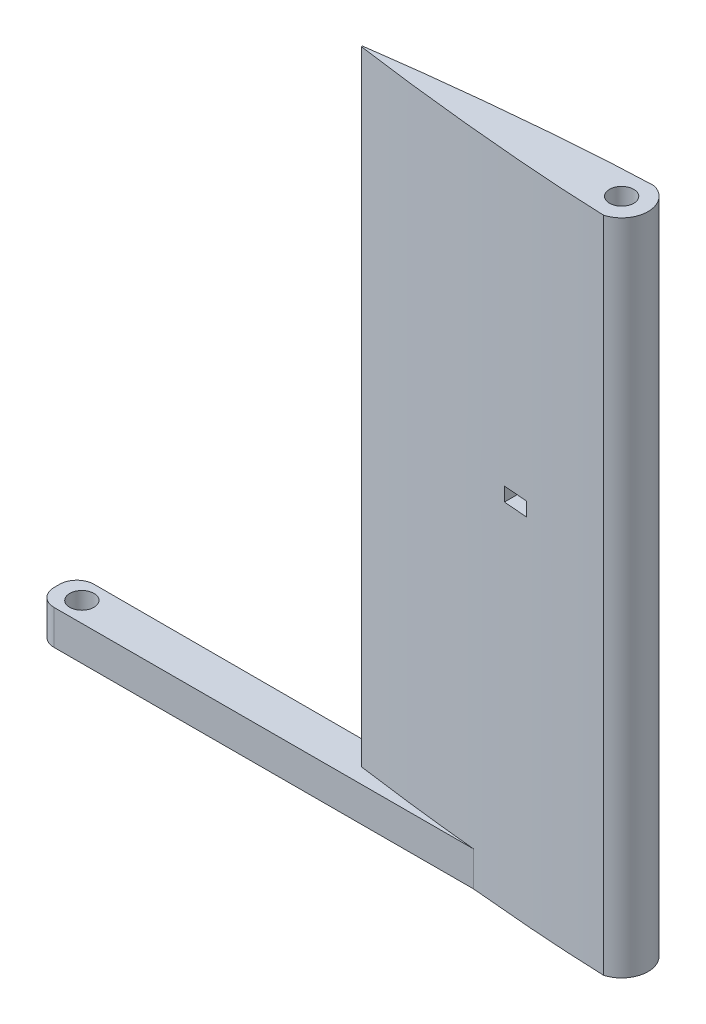
ISO-10303-21;
HEADER;
FILE_DESCRIPTION(('STEP AP214'),'2;1');
FILE_NAME('part.step','',(''),(''),'','','');
FILE_SCHEMA(('AUTOMOTIVE_DESIGN { 1 0 10303 214 1 1 1 1 }'));
ENDSEC;
DATA;
#1=APPLICATION_CONTEXT('core data for automotive mechanical design processes');
#2=APPLICATION_PROTOCOL_DEFINITION('international standard','automotive_design',2000,#1);
#3=PRODUCT_CONTEXT('',#1,'mechanical');
#4=PRODUCT('Part','Part','',(#3));
#5=PRODUCT_RELATED_PRODUCT_CATEGORY('part','',(#4));
#6=PRODUCT_DEFINITION_FORMATION('','',#4);
#7=PRODUCT_DEFINITION_CONTEXT('part definition',#1,'design');
#8=PRODUCT_DEFINITION('design','',#6,#7);
#9=PRODUCT_DEFINITION_SHAPE('','',#8);
#10=(LENGTH_UNIT() NAMED_UNIT(*) SI_UNIT(.MILLI.,.METRE.));
#11=(NAMED_UNIT(*) PLANE_ANGLE_UNIT() SI_UNIT($,.RADIAN.));
#12=(NAMED_UNIT(*) SI_UNIT($,.STERADIAN.) SOLID_ANGLE_UNIT());
#13=UNCERTAINTY_MEASURE_WITH_UNIT(LENGTH_MEASURE(1.E-05),#10,'distance_accuracy_value','');
#14=(GEOMETRIC_REPRESENTATION_CONTEXT(3) GLOBAL_UNCERTAINTY_ASSIGNED_CONTEXT((#13)) GLOBAL_UNIT_ASSIGNED_CONTEXT((#10,
#11,#12)) REPRESENTATION_CONTEXT('',''));
#15=CARTESIAN_POINT('',(0.,0.,0.));
#16=DIRECTION('',(0.,0.,1.));
#17=DIRECTION('',(1.,0.,0.));
#18=AXIS2_PLACEMENT_3D('',#15,#16,#17);
#19=CARTESIAN_POINT('',(-22.3000335584767,96.52,-0.421731992758527));
#20=CARTESIAN_POINT('',(-21.2419414138823,96.52,-0.275782192456182));
#21=CARTESIAN_POINT('',(-19.1268563533446,96.52,0.0159657841118418));
#22=CARTESIAN_POINT('',(-15.9513768445541,96.52,0.420945700754212));
#23=CARTESIAN_POINT('',(-12.7763413638604,96.52,0.805621297972043));
#24=CARTESIAN_POINT('',(-9.60116832794026,96.52,1.16714064150426));
#25=CARTESIAN_POINT('',(-6.42611192187,96.52,1.50822751108855));
#26=CARTESIAN_POINT('',(-3.25109867110428,96.52,1.82841891986337));
#27=CARTESIAN_POINT('',(-0.0761486453770277,96.52,2.12685616267836));
#28=CARTESIAN_POINT('',(3.09891867077607,96.52,2.39984293819857));
#29=CARTESIAN_POINT('',(6.27387103325091,96.52,2.64782488629556));
#30=CARTESIAN_POINT('',(9.47006467937847,96.52,2.8664977924313));
#31=CARTESIAN_POINT('',(12.6661626264162,96.52,3.05362844309234));
#32=CARTESIAN_POINT('',(15.1399259141342,96.52,3.16085624533642));
#33=CARTESIAN_POINT('',(16.5338816835493,96.52,3.21108424025308));
#34=CARTESIAN_POINT('',(16.8691309393359,96.52,3.22220716780132));
#35=B_SPLINE_CURVE_WITH_KNOTS('',3,(#19,#20,#21,#22,#23,#24,#25,#26,#27,#28,#29,#30,#31,#32,#33,
#34),.UNSPECIFIED.,.F.,.F.,(4,1,1,1,1,1,1,1,1,1,1,1,1,4),(0.697451101376656,0.722085332605875,
0.746693971874219,0.771280881618741,0.795847852353792,0.820397097848366,0.844929663207614,
0.869445681924214,0.893944653527209,0.918427287456432,0.942893193888412,0.967831579658849,
0.992264069895196,1.),.UNSPECIFIED.);
#36=DIRECTION('',(0.,-1.,0.));
#37=VECTOR('',#36,1.);
#38=SURFACE_OF_LINEAR_EXTRUSION('',#35,#37);
#39=CARTESIAN_POINT('',(-22.3000335584767,51.8554787804758,-0.421731992758527));
#40=CARTESIAN_POINT('',(-21.2419414138823,51.8554787804758,-0.275782192456182));
#41=CARTESIAN_POINT('',(-19.1268563533446,51.8554787804758,0.0159657841118418));
#42=CARTESIAN_POINT('',(-15.9513768445541,51.8554787804758,0.420945700754212));
#43=CARTESIAN_POINT('',(-12.7763413638604,51.8554787804758,0.805621297972043));
#44=CARTESIAN_POINT('',(-9.60116832794026,51.8554787804758,1.16714064150426));
#45=CARTESIAN_POINT('',(-6.42611192187,51.8554787804758,1.50822751108855));
#46=CARTESIAN_POINT('',(-3.25109867110428,51.8554787804758,1.82841891986337));
#47=CARTESIAN_POINT('',(-0.0761486453770277,51.8554787804758,2.12685616267836));
#48=CARTESIAN_POINT('',(3.09891867077607,51.8554787804758,2.39984293819857));
#49=CARTESIAN_POINT('',(6.27387103325091,51.8554787804758,2.64782488629556));
#50=CARTESIAN_POINT('',(9.47006467937847,51.8554787804758,2.8664977924313));
#51=CARTESIAN_POINT('',(12.6661626264162,51.8554787804758,3.05362844309234));
#52=CARTESIAN_POINT('',(15.1399259141342,51.8554787804758,3.16085624533642));
#53=CARTESIAN_POINT('',(16.5338816835493,51.8554787804758,3.21108424025308));
#54=CARTESIAN_POINT('',(16.8691309393359,51.8554787804758,3.22220716780132));
#55=B_SPLINE_CURVE_WITH_KNOTS('',3,(#39,#40,#41,#42,#43,#44,#45,#46,#47,#48,#49,#50,#51,#52,#53,
#54),.UNSPECIFIED.,.F.,.F.,(4,1,1,1,1,1,1,1,1,1,1,1,1,4),(0.697451101376656,0.722085332605875,
0.746693971874219,0.771280881618741,0.795847852353792,0.820397097848366,0.844929663207614,
0.869445681924214,0.893944653527209,0.918427287456432,0.942893193888412,0.967831579658849,
0.992264069895196,1.),.UNSPECIFIED.);
#56=CARTESIAN_POINT('',(4.90978113409312,51.8554787804758,2.54));
#57=VERTEX_POINT('',#56);
#58=CARTESIAN_POINT('',(1.35733648457214,51.8554787804757,2.24902105413004));
#59=VERTEX_POINT('',#58);
#60=EDGE_CURVE('E372',#57,#59,#55,.F.);
#61=ORIENTED_EDGE('',*,*,#60,.T.);
#62=DIRECTION('',(0.,-1.,0.));
#63=VECTOR('',#62,1.);
#64=CARTESIAN_POINT('',(1.35733648457217,96.52,2.24902105405757));
#65=LINE('',#64,#63);
#66=CARTESIAN_POINT('',(1.35733648457214,53.8874787804757,2.24902105413004));
#67=VERTEX_POINT('',#66);
#68=EDGE_CURVE('E326',#59,#67,#65,.F.);
#69=ORIENTED_EDGE('',*,*,#68,.T.);
#70=CARTESIAN_POINT('',(-22.3000335584767,53.8874787804758,-0.421731992758527));
#71=CARTESIAN_POINT('',(-21.2419414138823,53.8874787804758,-0.275782192456182));
#72=CARTESIAN_POINT('',(-19.1268563533446,53.8874787804758,0.0159657841118418));
#73=CARTESIAN_POINT('',(-15.9513768445541,53.8874787804758,0.420945700754212));
#74=CARTESIAN_POINT('',(-12.7763413638604,53.8874787804758,0.805621297972043));
#75=CARTESIAN_POINT('',(-9.60116832794026,53.8874787804758,1.16714064150426));
#76=CARTESIAN_POINT('',(-6.42611192187,53.8874787804758,1.50822751108855));
#77=CARTESIAN_POINT('',(-3.25109867110428,53.8874787804758,1.82841891986337));
#78=CARTESIAN_POINT('',(-0.0761486453770277,53.8874787804758,2.12685616267836));
#79=CARTESIAN_POINT('',(3.09891867077607,53.8874787804758,2.39984293819857));
#80=CARTESIAN_POINT('',(6.27387103325091,53.8874787804758,2.64782488629556));
#81=CARTESIAN_POINT('',(9.47006467937847,53.8874787804758,2.8664977924313));
#82=CARTESIAN_POINT('',(12.6661626264162,53.8874787804758,3.05362844309234));
#83=CARTESIAN_POINT('',(15.1399259141342,53.8874787804758,3.16085624533642));
#84=CARTESIAN_POINT('',(16.5338816835493,53.8874787804758,3.21108424025308));
#85=CARTESIAN_POINT('',(16.8691309393359,53.8874787804758,3.22220716780132));
#86=B_SPLINE_CURVE_WITH_KNOTS('',3,(#70,#71,#72,#73,#74,#75,#76,#77,#78,#79,#80,#81,#82,#83,#84,
#85),.UNSPECIFIED.,.F.,.F.,(4,1,1,1,1,1,1,1,1,1,1,1,1,4),(0.697451101376656,0.722085332605875,
0.746693971874219,0.771280881618741,0.795847852353792,0.820397097848366,0.844929663207614,
0.869445681924214,0.893944653527209,0.918427287456432,0.942893193888412,0.967831579658849,
0.992264069895196,1.),.UNSPECIFIED.);
#87=CARTESIAN_POINT('',(4.90978113409312,53.8874787804757,2.54));
#88=VERTEX_POINT('',#87);
#89=EDGE_CURVE('E378',#67,#88,#86,.T.);
#90=ORIENTED_EDGE('',*,*,#89,.T.);
#91=DIRECTION('',(0.,-1.,0.));
#92=VECTOR('',#91,1.);
#93=CARTESIAN_POINT('',(4.90978113409312,96.52,2.54));
#94=LINE('',#93,#92);
#95=EDGE_CURVE('E368',#88,#57,#94,.T.);
#96=ORIENTED_EDGE('',*,*,#95,.T.);
#97=EDGE_LOOP('',(#61,#69,#90,#96));
#98=FACE_BOUND('',#97,.T.);
#99=DIRECTION('',(0.,-1.,0.));
#100=VECTOR('',#99,1.);
#101=CARTESIAN_POINT('',(-3.63072966130504,5.08,1.78765447399676));
#102=LINE('',#101,#100);
#103=CARTESIAN_POINT('',(-3.63072964580733,5.08000000000003,1.78765447551925));
#104=VERTEX_POINT('',#103);
#105=CARTESIAN_POINT('',(-3.63072966130504,0.,1.78765447399676));
#106=VERTEX_POINT('',#105);
#107=EDGE_CURVE('E174',#104,#106,#102,.T.);
#108=ORIENTED_EDGE('',*,*,#107,.T.);
#109=CARTESIAN_POINT('',(-22.3000335584767,0.,-0.421731992758527));
#110=CARTESIAN_POINT('',(-21.2419414138823,0.,-0.275782192456182));
#111=CARTESIAN_POINT('',(-19.1268563533446,0.,0.0159657841118418));
#112=CARTESIAN_POINT('',(-15.9513768445541,0.,0.420945700754212));
#113=CARTESIAN_POINT('',(-12.7763413638604,0.,0.805621297972043));
#114=CARTESIAN_POINT('',(-9.60116832794026,0.,1.16714064150426));
#115=CARTESIAN_POINT('',(-6.42611192187,0.,1.50822751108855));
#116=CARTESIAN_POINT('',(-3.25109867110428,0.,1.82841891986337));
#117=CARTESIAN_POINT('',(-0.0761486453770277,0.,2.12685616267836));
#118=CARTESIAN_POINT('',(3.09891867077607,0.,2.39984293819857));
#119=CARTESIAN_POINT('',(6.27387103325091,0.,2.64782488629556));
#120=CARTESIAN_POINT('',(9.47006467937847,0.,2.8664977924313));
#121=CARTESIAN_POINT('',(12.6661626264162,0.,3.05362844309234));
#122=CARTESIAN_POINT('',(15.1399259141342,0.,3.16085624533642));
#123=CARTESIAN_POINT('',(16.5338816835493,0.,3.21108424025308));
#124=CARTESIAN_POINT('',(16.8691309393359,0.,3.22220716780132));
#125=B_SPLINE_CURVE_WITH_KNOTS('',3,(#109,#110,#111,#112,#113,#114,#115,#116,#117,#118,#119,
#120,#121,#122,#123,#124),.UNSPECIFIED.,.F.,.F.,(4,1,1,1,1,1,1,1,1,1,1,1,1,4),
(0.697451101376656,0.722085332605875,0.746693971874219,0.771280881618741,0.795847852353792,
0.820397097848366,0.844929663207614,0.869445681924214,0.893944653527209,0.918427287456432,
0.942893193888412,0.967831579658849,0.992264069895196,1.),.UNSPECIFIED.);
#126=CARTESIAN_POINT('',(16.8691309393359,0.,3.22220716780132));
#127=VERTEX_POINT('',#126);
#128=EDGE_CURVE('E265',#106,#127,#125,.T.);
#129=ORIENTED_EDGE('',*,*,#128,.T.);
#130=DIRECTION('',(0.,-1.,0.));
#131=VECTOR('',#130,1.);
#132=CARTESIAN_POINT('',(16.8691309393359,96.52,3.22220716780132));
#133=LINE('',#132,#131);
#134=CARTESIAN_POINT('',(16.8691309393359,96.52,3.22220716780132));
#135=VERTEX_POINT('',#134);
#136=EDGE_CURVE('E364',#135,#127,#133,.T.);
#137=ORIENTED_EDGE('',*,*,#136,.F.);
#138=CARTESIAN_POINT('',(-22.3000335584767,96.52,-0.421731992758527));
#139=VERTEX_POINT('',#138);
#140=EDGE_CURVE('E269',#139,#135,#35,.T.);
#141=ORIENTED_EDGE('',*,*,#140,.F.);
#142=DIRECTION('',(0.,-1.,0.));
#143=VECTOR('',#142,1.);
#144=CARTESIAN_POINT('',(-22.3000335584767,96.52,-0.421731992758527));
#145=LINE('',#144,#143);
#146=CARTESIAN_POINT('',(-22.3000335584767,5.08000000000006,-0.421731992758527));
#147=VERTEX_POINT('',#146);
#148=EDGE_CURVE('E354',#139,#147,#145,.T.);
#149=ORIENTED_EDGE('',*,*,#148,.T.);
#150=CARTESIAN_POINT('',(-22.3000335584767,5.08,-0.421731992758527));
#151=CARTESIAN_POINT('',(-21.2419414138823,5.08,-0.275782192456182));
#152=CARTESIAN_POINT('',(-19.1268563533446,5.08,0.0159657841118418));
#153=CARTESIAN_POINT('',(-15.9513768445541,5.08,0.420945700754212));
#154=CARTESIAN_POINT('',(-12.7763413638604,5.08,0.805621297972043));
#155=CARTESIAN_POINT('',(-9.60116832794026,5.08,1.16714064150426));
#156=CARTESIAN_POINT('',(-6.42611192187,5.08,1.50822751108855));
#157=CARTESIAN_POINT('',(-3.25109867110428,5.08,1.82841891986337));
#158=CARTESIAN_POINT('',(-0.0761486453770277,5.08,2.12685616267836));
#159=CARTESIAN_POINT('',(3.09891867077607,5.08,2.39984293819857));
#160=CARTESIAN_POINT('',(6.27387103325091,5.08,2.64782488629556));
#161=CARTESIAN_POINT('',(9.47006467937847,5.08,2.8664977924313));
#162=CARTESIAN_POINT('',(12.6661626264162,5.08,3.05362844309234));
#163=CARTESIAN_POINT('',(15.1399259141342,5.08,3.16085624533642));
#164=CARTESIAN_POINT('',(16.5338816835493,5.08,3.21108424025308));
#165=CARTESIAN_POINT('',(16.8691309393359,5.08,3.22220716780132));
#166=B_SPLINE_CURVE_WITH_KNOTS('',3,(#150,#151,#152,#153,#154,#155,#156,#157,#158,#159,#160,
#161,#162,#163,#164,#165),.UNSPECIFIED.,.F.,.F.,(4,1,1,1,1,1,1,1,1,1,1,1,1,4),
(0.697451101376656,0.722085332605875,0.746693971874219,0.771280881618741,0.795847852353792,
0.820397097848366,0.844929663207614,0.869445681924214,0.893944653527209,0.918427287456432,
0.942893193888412,0.967831579658849,0.992264069895196,1.),.UNSPECIFIED.);
#167=EDGE_CURVE('E202',#147,#104,#166,.T.);
#168=ORIENTED_EDGE('',*,*,#167,.T.);
#169=EDGE_LOOP('',(#108,#129,#137,#141,#149,#168));
#170=FACE_BOUND('',#169,.T.);
#171=ADVANCED_FACE('F49',(#98,#170),#38,.F.);
#172=CARTESIAN_POINT('',(-22.3000335584767,96.52,-0.421731992758527));
#173=DIRECTION('',(1.,0.,0.));
#174=DIRECTION('',(0.,0.,-1.));
#175=AXIS2_PLACEMENT_3D('',#172,#173,#174);
#176=PLANE('',#175);
#177=DIRECTION('',(0.,0.,1.));
#178=VECTOR('',#177,1.);
#179=CARTESIAN_POINT('',(-22.3000335584767,5.08,0.));
#180=LINE('',#179,#178);
#181=CARTESIAN_POINT('',(-22.3000335584767,5.08000000000006,-0.581751992758527));
#182=VERTEX_POINT('',#181);
#183=EDGE_CURVE('E191',#182,#147,#180,.T.);
#184=ORIENTED_EDGE('',*,*,#183,.T.);
#185=ORIENTED_EDGE('',*,*,#148,.F.);
#186=DIRECTION('',(0.,0.,1.));
#187=VECTOR('',#186,1.);
#188=CARTESIAN_POINT('',(-22.3000335584767,96.52,-0.421731992758527));
#189=LINE('',#188,#187);
#190=CARTESIAN_POINT('',(-22.3000335584767,96.52,-0.581751992758527));
#191=VERTEX_POINT('',#190);
#192=EDGE_CURVE('E448',#191,#139,#189,.T.);
#193=ORIENTED_EDGE('',*,*,#192,.F.);
#194=DIRECTION('',(0.,-1.,0.));
#195=VECTOR('',#194,1.);
#196=CARTESIAN_POINT('',(-22.3000335584767,96.52,-0.581751992758527));
#197=LINE('',#196,#195);
#198=EDGE_CURVE('E348',#191,#182,#197,.T.);
#199=ORIENTED_EDGE('',*,*,#198,.T.);
#200=EDGE_LOOP('',(#184,#185,#193,#199));
#201=FACE_BOUND('',#200,.T.);
#202=ADVANCED_FACE('F285',(#201),#176,.F.);
#203=CARTESIAN_POINT('',(-2.75858095506665,96.52,1.87251251827718));
#204=DIRECTION('',(0.,1.,0.));
#205=DIRECTION('',(0.,0.,1.));
#206=AXIS2_PLACEMENT_3D('',#203,#204,#205);
#207=PLANE('',#206);
#208=ORIENTED_EDGE('',*,*,#140,.T.);
#209=CARTESIAN_POINT('',(15.7860682767579,96.52,-0.501741992758527));
#210=DIRECTION('',(0.,1.,0.));
#211=DIRECTION('',(0.,0.,1.));
#212=AXIS2_PLACEMENT_3D('',#209,#210,#211);
#213=CIRCLE('',#212,3.87824987352607);
#214=CARTESIAN_POINT('',(16.8691309393359,96.52,-4.22569115331837));
#215=VERTEX_POINT('',#214);
#216=EDGE_CURVE('E276',#135,#215,#213,.T.);
#217=ORIENTED_EDGE('',*,*,#216,.T.);
#218=CARTESIAN_POINT('',(16.8691309393359,96.52,-4.22569115331837));
#219=CARTESIAN_POINT('',(16.5338816835493,96.52,-4.21456822577014));
#220=CARTESIAN_POINT('',(15.1399259141342,96.52,-4.16434023085348));
#221=CARTESIAN_POINT('',(12.6661626264162,96.52,-4.05711242860939));
#222=CARTESIAN_POINT('',(9.47006467937846,96.52,-3.86998177794835));
#223=CARTESIAN_POINT('',(6.27387103325089,96.52,-3.65130887181262));
#224=CARTESIAN_POINT('',(3.09891867077607,96.52,-3.40332692371562));
#225=CARTESIAN_POINT('',(-0.0761486453770208,96.52,-3.13034014819541));
#226=CARTESIAN_POINT('',(-3.25109867110428,96.52,-2.83190290538043));
#227=CARTESIAN_POINT('',(-6.42611192186998,96.52,-2.5117114966056));
#228=CARTESIAN_POINT('',(-9.60116832794028,96.52,-2.17062462702132));
#229=CARTESIAN_POINT('',(-12.7763413638605,96.52,-1.8091052834891));
#230=CARTESIAN_POINT('',(-15.9513768445541,96.52,-1.42442968627127));
#231=CARTESIAN_POINT('',(-19.1268563533446,96.52,-1.0194497696289));
#232=CARTESIAN_POINT('',(-21.2419414138823,96.52,-0.727701793060872));
#233=CARTESIAN_POINT('',(-22.3000335584767,96.52,-0.581751992758527));
#234=B_SPLINE_CURVE_WITH_KNOTS('',3,(#218,#219,#220,#221,#222,#223,#224,#225,#226,#227,#228,
#229,#230,#231,#232,#233),.UNSPECIFIED.,.F.,.F.,(4,1,1,1,1,1,1,1,1,1,1,1,1,4),(0.,
0.00773593010480417,0.0321684203411504,0.0571068061115878,0.0815727125435676,0.106055346472791,
0.130554318075786,0.155070336792386,0.179602902151634,0.204152147646207,0.228719118381258,
0.253306028125781,0.277914667394125,0.302548898623344),.UNSPECIFIED.);
#235=EDGE_CURVE('E442',#215,#191,#234,.T.);
#236=ORIENTED_EDGE('',*,*,#235,.T.);
#237=ORIENTED_EDGE('',*,*,#192,.T.);
#238=EDGE_LOOP('',(#208,#217,#236,#237));
#239=FACE_BOUND('',#238,.T.);
#240=CARTESIAN_POINT('',(15.7860682767579,96.52,-0.501741992758527));
#241=DIRECTION('',(0.,1.,0.));
#242=DIRECTION('',(0.,0.,1.));
#243=AXIS2_PLACEMENT_3D('',#240,#241,#242);
#244=CIRCLE('',#243,1.77800000000077);
#245=CARTESIAN_POINT('',(15.7860682767579,96.52,-2.2797419927593));
#246=VERTEX_POINT('',#245);
#247=EDGE_CURVE('E261',#246,#246,#244,.T.);
#248=ORIENTED_EDGE('',*,*,#247,.F.);
#249=EDGE_LOOP('',(#248));
#250=FACE_BOUND('',#249,.T.);
#251=ADVANCED_FACE('F430',(#239,#250),#207,.T.);
#252=CARTESIAN_POINT('',(-2.75858095506665,0.,1.87251251827718));
#253=DIRECTION('',(0.,1.,0.));
#254=DIRECTION('',(0.,0.,1.));
#255=AXIS2_PLACEMENT_3D('',#252,#253,#254);
#256=PLANE('',#255);
#257=CARTESIAN_POINT('',(-63.9167227062747,0.,-1.05808459233403));
#258=DIRECTION('',(0.,-1.,0.));
#259=DIRECTION('',(0.,0.,-1.));
#260=AXIS2_PLACEMENT_3D('',#257,#258,#259);
#261=CIRCLE('',#260,1.77800000000001);
#262=CARTESIAN_POINT('',(-63.9167227062747,0.,-2.83608459233403));
#263=VERTEX_POINT('',#262);
#264=EDGE_CURVE('E197',#263,#263,#261,.T.);
#265=ORIENTED_EDGE('',*,*,#264,.F.);
#266=EDGE_LOOP('',(#265));
#267=FACE_BOUND('',#266,.T.);
#268=DIRECTION('',(0.999998974180629,0.,-0.00143235389845195));
#269=VECTOR('',#268,1.);
#270=CARTESIAN_POINT('',(0.00255310228643176,0.,1.78245032192763));
#271=LINE('',#270,#269);
#272=CARTESIAN_POINT('',(-65.0491365263648,0.,1.87562745875103));
#273=VERTEX_POINT('',#272);
#274=EDGE_CURVE('E207',#273,#106,#271,.T.);
#275=ORIENTED_EDGE('',*,*,#274,.F.);
#276=CARTESIAN_POINT('',(-65.0527747052669,0.,-0.66436993566777));
#277=DIRECTION('',(0.,1.,0.));
#278=DIRECTION('',(0.,0.,1.));
#279=AXIS2_PLACEMENT_3D('',#276,#277,#278);
#280=CIRCLE('',#279,2.54);
#281=CARTESIAN_POINT('',(-67.5927747052669,0.,-0.66436993566777));
#282=VERTEX_POINT('',#281);
#283=EDGE_CURVE('E318',#273,#282,#280,.F.);
#284=ORIENTED_EDGE('',*,*,#283,.T.);
#285=DIRECTION('',(0.,0.,-1.));
#286=VECTOR('',#285,1.);
#287=CARTESIAN_POINT('',(-67.5927747052669,0.,0.));
#288=LINE('',#287,#286);
#289=CARTESIAN_POINT('',(-67.5927747052669,0.,-1.45544003721835));
#290=VERTEX_POINT('',#289);
#291=EDGE_CURVE('E193',#282,#290,#288,.T.);
#292=ORIENTED_EDGE('',*,*,#291,.T.);
#293=CARTESIAN_POINT('',(-65.0527747052669,0.,-1.45544003721835));
#294=DIRECTION('',(0.,1.,0.));
#295=DIRECTION('',(0.,0.,1.));
#296=AXIS2_PLACEMENT_3D('',#293,#294,#295);
#297=CIRCLE('',#296,2.54);
#298=CARTESIAN_POINT('',(-65.0527747052669,0.,-3.99544003721835));
#299=VERTEX_POINT('',#298);
#300=EDGE_CURVE('E321',#290,#299,#297,.F.);
#301=ORIENTED_EDGE('',*,*,#300,.T.);
#302=DIRECTION('',(-1.,0.,0.));
#303=VECTOR('',#302,1.);
#304=CARTESIAN_POINT('',(0.,0.,-3.99544003721835));
#305=LINE('',#304,#303);
#306=CARTESIAN_POINT('',(-16.7927747052669,0.,-3.99544003721835));
#307=VERTEX_POINT('',#306);
#308=EDGE_CURVE('E187',#307,#299,#305,.T.);
#309=ORIENTED_EDGE('',*,*,#308,.F.);
#310=DIRECTION('',(0.991139066371173,0.,0.132828276782016));
#311=VECTOR('',#310,1.);
#312=CARTESIAN_POINT('',(0.229724031663285,0.,-1.71415656200546));
#313=LINE('',#312,#311);
#314=CARTESIAN_POINT('',(-6.0142336545393,0.,-2.55094543296085));
#315=VERTEX_POINT('',#314);
#316=EDGE_CURVE('E170',#307,#315,#313,.T.);
#317=ORIENTED_EDGE('',*,*,#316,.T.);
#318=CARTESIAN_POINT('',(16.8691309393359,0.,-4.22569115331837));
#319=CARTESIAN_POINT('',(16.5338816835493,0.,-4.21456822577014));
#320=CARTESIAN_POINT('',(15.1399259141342,0.,-4.16434023085348));
#321=CARTESIAN_POINT('',(12.6661626264162,0.,-4.05711242860939));
#322=CARTESIAN_POINT('',(9.47006467937846,0.,-3.86998177794835));
#323=CARTESIAN_POINT('',(6.27387103325089,0.,-3.65130887181262));
#324=CARTESIAN_POINT('',(3.09891867077607,0.,-3.40332692371562));
#325=CARTESIAN_POINT('',(-0.0761486453770208,0.,-3.13034014819541));
#326=CARTESIAN_POINT('',(-3.25109867110428,0.,-2.83190290538043));
#327=CARTESIAN_POINT('',(-6.42611192186998,0.,-2.5117114966056));
#328=CARTESIAN_POINT('',(-9.60116832794028,0.,-2.17062462702132));
#329=CARTESIAN_POINT('',(-12.7763413638605,0.,-1.8091052834891));
#330=CARTESIAN_POINT('',(-15.9513768445541,0.,-1.42442968627127));
#331=CARTESIAN_POINT('',(-19.1268563533446,0.,-1.0194497696289));
#332=CARTESIAN_POINT('',(-21.2419414138823,0.,-0.727701793060872));
#333=CARTESIAN_POINT('',(-22.3000335584767,0.,-0.581751992758527));
#334=B_SPLINE_CURVE_WITH_KNOTS('',3,(#318,#319,#320,#321,#322,#323,#324,#325,#326,#327,#328,
#329,#330,#331,#332,#333),.UNSPECIFIED.,.F.,.F.,(4,1,1,1,1,1,1,1,1,1,1,1,1,4),(0.,
0.00773593010480417,0.0321684203411504,0.0571068061115878,0.0815727125435676,0.106055346472791,
0.130554318075786,0.155070336792386,0.179602902151634,0.204152147646207,0.228719118381258,
0.253306028125781,0.277914667394125,0.302548898623344),.UNSPECIFIED.);
#335=CARTESIAN_POINT('',(16.8691309393359,0.,-4.22569115331837));
#336=VERTEX_POINT('',#335);
#337=EDGE_CURVE('E277',#336,#315,#334,.T.);
#338=ORIENTED_EDGE('',*,*,#337,.F.);
#339=CARTESIAN_POINT('',(15.7860682767579,0.,-0.501741992758527));
#340=DIRECTION('',(0.,1.,0.));
#341=DIRECTION('',(0.,0.,1.));
#342=AXIS2_PLACEMENT_3D('',#339,#340,#341);
#343=CIRCLE('',#342,3.87824987352607);
#344=EDGE_CURVE('E458',#127,#336,#343,.T.);
#345=ORIENTED_EDGE('',*,*,#344,.F.);
#346=ORIENTED_EDGE('',*,*,#128,.F.);
#347=EDGE_LOOP('',(#275,#284,#292,#301,#309,#317,#338,#345,#346));
#348=FACE_BOUND('',#347,.T.);
#349=CARTESIAN_POINT('',(15.7860682767579,0.,-0.501741992758527));
#350=DIRECTION('',(0.,1.,0.));
#351=DIRECTION('',(0.,0.,1.));
#352=AXIS2_PLACEMENT_3D('',#349,#350,#351);
#353=CIRCLE('',#352,1.77800000000077);
#354=CARTESIAN_POINT('',(15.7860682767579,0.,-2.2797419927593));
#355=VERTEX_POINT('',#354);
#356=EDGE_CURVE('E250',#355,#355,#353,.T.);
#357=ORIENTED_EDGE('',*,*,#356,.T.);
#358=EDGE_LOOP('',(#357));
#359=FACE_BOUND('',#358,.T.);
#360=ADVANCED_FACE('F433',(#267,#348,#359),#256,.F.);
#361=CARTESIAN_POINT('',(15.7860682767579,96.52,-0.501741992758527));
#362=DIRECTION('',(0.,-1.,0.));
#363=DIRECTION('',(0.,0.,-1.));
#364=AXIS2_PLACEMENT_3D('',#361,#362,#363);
#365=CYLINDRICAL_SURFACE('',#364,3.87824987352607);
#366=ORIENTED_EDGE('',*,*,#344,.T.);
#367=DIRECTION('',(0.,-1.,0.));
#368=VECTOR('',#367,1.);
#369=CARTESIAN_POINT('',(16.8691309393359,96.52,-4.22569115331837));
#370=LINE('',#369,#368);
#371=EDGE_CURVE('E353',#215,#336,#370,.T.);
#372=ORIENTED_EDGE('',*,*,#371,.F.);
#373=ORIENTED_EDGE('',*,*,#216,.F.);
#374=ORIENTED_EDGE('',*,*,#136,.T.);
#375=EDGE_LOOP('',(#366,#372,#373,#374));
#376=FACE_BOUND('',#375,.T.);
#377=ADVANCED_FACE('F287',(#376),#365,.T.);
#378=DIRECTION('',(0.,-1.,0.));
#379=VECTOR('',#378,1.);
#380=SURFACE_OF_LINEAR_EXTRUSION('',#234,#379);
#381=ORIENTED_EDGE('',*,*,#337,.T.);
#382=DIRECTION('',(0.,-1.,0.));
#383=VECTOR('',#382,1.);
#384=CARTESIAN_POINT('',(-6.0142336568795,5.08,-2.55094543271915));
#385=LINE('',#384,#383);
#386=CARTESIAN_POINT('',(-6.0142336545393,5.08000000000003,-2.55094543296085));
#387=VERTEX_POINT('',#386);
#388=EDGE_CURVE('E179',#387,#315,#385,.T.);
#389=ORIENTED_EDGE('',*,*,#388,.F.);
#390=CARTESIAN_POINT('',(16.8691309393359,5.08,-4.22569115331837));
#391=CARTESIAN_POINT('',(16.5338816835493,5.08,-4.21456822577014));
#392=CARTESIAN_POINT('',(15.1399259141342,5.08,-4.16434023085348));
#393=CARTESIAN_POINT('',(12.6661626264162,5.08,-4.05711242860939));
#394=CARTESIAN_POINT('',(9.47006467937846,5.08,-3.86998177794835));
#395=CARTESIAN_POINT('',(6.27387103325089,5.08,-3.65130887181262));
#396=CARTESIAN_POINT('',(3.09891867077607,5.08,-3.40332692371562));
#397=CARTESIAN_POINT('',(-0.0761486453770208,5.08,-3.13034014819541));
#398=CARTESIAN_POINT('',(-3.25109867110428,5.08,-2.83190290538043));
#399=CARTESIAN_POINT('',(-6.42611192186998,5.08,-2.5117114966056));
#400=CARTESIAN_POINT('',(-9.60116832794028,5.08,-2.17062462702132));
#401=CARTESIAN_POINT('',(-12.7763413638605,5.08,-1.8091052834891));
#402=CARTESIAN_POINT('',(-15.9513768445541,5.08,-1.42442968627127));
#403=CARTESIAN_POINT('',(-19.1268563533446,5.08,-1.0194497696289));
#404=CARTESIAN_POINT('',(-21.2419414138823,5.08,-0.727701793060872));
#405=CARTESIAN_POINT('',(-22.3000335584767,5.08,-0.581751992758527));
#406=B_SPLINE_CURVE_WITH_KNOTS('',3,(#390,#391,#392,#393,#394,#395,#396,#397,#398,#399,#400,
#401,#402,#403,#404,#405),.UNSPECIFIED.,.F.,.F.,(4,1,1,1,1,1,1,1,1,1,1,1,1,4),(0.,
0.00773593010480417,0.0321684203411504,0.0571068061115878,0.0815727125435676,0.106055346472791,
0.130554318075786,0.155070336792386,0.179602902151634,0.204152147646207,0.228719118381258,
0.253306028125781,0.277914667394125,0.302548898623344),.UNSPECIFIED.);
#407=EDGE_CURVE('E185',#387,#182,#406,.T.);
#408=ORIENTED_EDGE('',*,*,#407,.T.);
#409=ORIENTED_EDGE('',*,*,#198,.F.);
#410=ORIENTED_EDGE('',*,*,#235,.F.);
#411=ORIENTED_EDGE('',*,*,#371,.T.);
#412=EDGE_LOOP('',(#381,#389,#408,#409,#410,#411));
#413=FACE_BOUND('',#412,.T.);
#414=ADVANCED_FACE('F428',(#413),#380,.F.);
#415=CARTESIAN_POINT('',(15.7860682767579,96.52,-0.501741992758527));
#416=DIRECTION('',(0.,-1.,0.));
#417=DIRECTION('',(0.,0.,-1.));
#418=AXIS2_PLACEMENT_3D('',#415,#416,#417);
#419=CYLINDRICAL_SURFACE('',#418,1.77800000000077);
#420=CARTESIAN_POINT('',(15.7860682767579,96.52,-2.2797419927593));
#421=CARTESIAN_POINT('',(15.7860682767579,95.5145833333333,-2.2797419927593));
#422=CARTESIAN_POINT('',(15.7860682767579,94.5091666666666,-2.2797419927593));
#423=CARTESIAN_POINT('',(15.7860682767579,92.4983333333333,-2.2797419927593));
#424=CARTESIAN_POINT('',(15.7860682767579,91.4929166666666,-2.2797419927593));
#425=CARTESIAN_POINT('',(15.7860682767579,89.4820833333333,-2.2797419927593));
#426=CARTESIAN_POINT('',(15.7860682767579,88.4766666666666,-2.2797419927593));
#427=CARTESIAN_POINT('',(15.7860682767579,86.4658333333333,-2.2797419927593));
#428=CARTESIAN_POINT('',(15.7860682767579,85.4604166666666,-2.2797419927593));
#429=CARTESIAN_POINT('',(15.7860682767579,83.4495833333333,-2.2797419927593));
#430=CARTESIAN_POINT('',(15.7860682767579,82.4441666666666,-2.2797419927593));
#431=CARTESIAN_POINT('',(15.7860682767579,80.4333333333333,-2.2797419927593));
#432=CARTESIAN_POINT('',(15.7860682767579,79.4279166666666,-2.2797419927593));
#433=CARTESIAN_POINT('',(15.7860682767579,77.4170833333333,-2.2797419927593));
#434=CARTESIAN_POINT('',(15.7860682767579,76.4116666666667,-2.2797419927593));
#435=CARTESIAN_POINT('',(15.7860682767579,74.4008333333333,-2.2797419927593));
#436=CARTESIAN_POINT('',(15.7860682767579,73.3954166666667,-2.2797419927593));
#437=CARTESIAN_POINT('',(15.7860682767579,71.3845833333333,-2.2797419927593));
#438=CARTESIAN_POINT('',(15.7860682767579,70.3791666666666,-2.2797419927593));
#439=CARTESIAN_POINT('',(15.7860682767579,68.3683333333333,-2.2797419927593));
#440=CARTESIAN_POINT('',(15.7860682767579,67.3629166666666,-2.2797419927593));
#441=CARTESIAN_POINT('',(15.7860682767579,65.3520833333333,-2.2797419927593));
#442=CARTESIAN_POINT('',(15.7860682767579,64.3466666666666,-2.2797419927593));
#443=CARTESIAN_POINT('',(15.7860682767579,62.3358333333333,-2.2797419927593));
#444=CARTESIAN_POINT('',(15.7860682767579,61.3304166666667,-2.2797419927593));
#445=CARTESIAN_POINT('',(15.7860682767579,59.3195833333333,-2.2797419927593));
#446=CARTESIAN_POINT('',(15.7860682767579,58.3141666666667,-2.2797419927593));
#447=CARTESIAN_POINT('',(15.7860682767579,56.3033333333333,-2.2797419927593));
#448=CARTESIAN_POINT('',(15.7860682767579,55.2979166666667,-2.2797419927593));
#449=CARTESIAN_POINT('',(15.7860682767579,53.2870833333333,-2.2797419927593));
#450=CARTESIAN_POINT('',(15.7860682767579,52.2816666666667,-2.2797419927593));
#451=CARTESIAN_POINT('',(15.7860682767579,50.2708333333333,-2.2797419927593));
#452=CARTESIAN_POINT('',(15.7860682767579,49.2654166666667,-2.2797419927593));
#453=CARTESIAN_POINT('',(15.7860682767579,47.2545833333333,-2.2797419927593));
#454=CARTESIAN_POINT('',(15.7860682767579,46.2491666666667,-2.2797419927593));
#455=CARTESIAN_POINT('',(15.7860682767579,44.2383333333333,-2.2797419927593));
#456=CARTESIAN_POINT('',(15.7860682767579,43.2329166666667,-2.2797419927593));
#457=CARTESIAN_POINT('',(15.7860682767579,41.2220833333333,-2.2797419927593));
#458=CARTESIAN_POINT('',(15.7860682767579,40.2166666666667,-2.2797419927593));
#459=CARTESIAN_POINT('',(15.7860682767579,38.2058333333333,-2.2797419927593));
#460=CARTESIAN_POINT('',(15.7860682767579,37.2004166666667,-2.2797419927593));
#461=CARTESIAN_POINT('',(15.7860682767579,35.1895833333333,-2.2797419927593));
#462=CARTESIAN_POINT('',(15.7860682767579,34.1841666666667,-2.2797419927593));
#463=CARTESIAN_POINT('',(15.7860682767579,32.1733333333333,-2.2797419927593));
#464=CARTESIAN_POINT('',(15.7860682767579,31.1679166666667,-2.2797419927593));
#465=CARTESIAN_POINT('',(15.7860682767579,29.1570833333333,-2.2797419927593));
#466=CARTESIAN_POINT('',(15.7860682767579,28.1516666666667,-2.2797419927593));
#467=CARTESIAN_POINT('',(15.7860682767579,26.1408333333333,-2.2797419927593));
#468=CARTESIAN_POINT('',(15.7860682767579,25.1354166666667,-2.2797419927593));
#469=CARTESIAN_POINT('',(15.7860682767579,23.1245833333333,-2.2797419927593));
#470=CARTESIAN_POINT('',(15.7860682767579,22.1191666666667,-2.2797419927593));
#471=CARTESIAN_POINT('',(15.7860682767579,20.1083333333333,-2.2797419927593));
#472=CARTESIAN_POINT('',(15.7860682767579,19.1029166666667,-2.2797419927593));
#473=CARTESIAN_POINT('',(15.7860682767579,17.0920833333333,-2.2797419927593));
#474=CARTESIAN_POINT('',(15.7860682767579,16.0866666666667,-2.2797419927593));
#475=CARTESIAN_POINT('',(15.7860682767579,14.0758333333333,-2.2797419927593));
#476=CARTESIAN_POINT('',(15.7860682767579,13.0704166666667,-2.2797419927593));
#477=CARTESIAN_POINT('',(15.7860682767579,11.0595833333333,-2.2797419927593));
#478=CARTESIAN_POINT('',(15.7860682767579,10.0541666666667,-2.2797419927593));
#479=CARTESIAN_POINT('',(15.7860682767579,8.04333333333331,-2.2797419927593));
#480=CARTESIAN_POINT('',(15.7860682767579,7.03791666666665,-2.2797419927593));
#481=CARTESIAN_POINT('',(15.7860682767579,5.02708333333332,-2.2797419927593));
#482=CARTESIAN_POINT('',(15.7860682767579,4.02166666666665,-2.2797419927593));
#483=CARTESIAN_POINT('',(15.7860682767579,2.01083333333332,-2.2797419927593));
#484=CARTESIAN_POINT('',(15.7860682767579,1.00541666666665,-2.2797419927593));
#485=CARTESIAN_POINT('',(15.7860682767579,0.,-2.2797419927593));
#486=B_SPLINE_CURVE_WITH_KNOTS('',3,(#420,#421,#422,#423,#424,#425,#426,#427,#428,#429,#430,
#431,#432,#433,#434,#435,#436,#437,#438,#439,#440,#441,#442,#443,#444,#445,#446,#447,#448,#449,
#450,#451,#452,#453,#454,#455,#456,#457,#458,#459,#460,#461,#462,#463,#464,#465,#466,#467,#468,
#469,#470,#471,#472,#473,#474,#475,#476,#477,#478,#479,#480,#481,#482,#483,#484,#485),
.UNSPECIFIED.,.F.,.F.,(4,2,2,2,2,2,2,2,2,2,2,2,2,2,2,2,2,2,2,2,2,2,2,2,2,2,2,2,2,2,2,2,4),(0.,
3.01625,6.0325,9.04874999999999,12.065,15.08125,18.0975,21.11375,24.13,27.14625,30.1625,
33.17875,36.195,39.21125,42.2275,45.24375,48.26,51.27625,54.2925,57.30875,60.325,63.34125,
66.3575,69.37375,72.39,75.40625,78.4225,81.43875,84.455,87.47125,90.4875,93.50375,96.52),.UNSPECIFIED.);
#487=EDGE_CURVE('BSEAM425',#246,#355,#486,.T.);
#488=ORIENTED_EDGE('',*,*,#247,.T.);
#489=ORIENTED_EDGE('',*,*,#356,.F.);
#490=ORIENTED_EDGE('',*,*,#487,.T.);
#491=ORIENTED_EDGE('',*,*,#487,.F.);
#492=EDGE_LOOP('',(#488,#490,#489,#491));
#493=FACE_BOUND('',#492,.T.);
#494=ADVANCED_FACE('F425',(#493),#419,.F.);
#495=CARTESIAN_POINT('',(1.35733648457214,51.8554787804757,-0.507999999999992));
#496=DIRECTION('',(-1.,0.,0.));
#497=DIRECTION('',(0.,-1.,0.));
#498=AXIS2_PLACEMENT_3D('',#495,#496,#497);
#499=PLANE('',#498);
#500=DIRECTION('',(0.,0.,1.));
#501=VECTOR('',#500,1.);
#502=CARTESIAN_POINT('',(1.35733648457214,51.8554787804757,-0.507999999999992));
#503=LINE('',#502,#501);
#504=CARTESIAN_POINT('',(1.35733648457214,51.8554787804757,-0.507999999999992));
#505=VERTEX_POINT('',#504);
#506=EDGE_CURVE('E236',#505,#59,#503,.T.);
#507=ORIENTED_EDGE('',*,*,#506,.F.);
#508=DIRECTION('',(0.,-1.,0.));
#509=VECTOR('',#508,1.);
#510=CARTESIAN_POINT('',(1.35733648457214,51.8554787804757,-0.507999999999992));
#511=LINE('',#510,#509);
#512=CARTESIAN_POINT('',(1.35733648457214,53.8874787804757,-0.507999999999992));
#513=VERTEX_POINT('',#512);
#514=EDGE_CURVE('E219',#513,#505,#511,.T.);
#515=ORIENTED_EDGE('',*,*,#514,.F.);
#516=DIRECTION('',(0.,0.,1.));
#517=VECTOR('',#516,1.);
#518=CARTESIAN_POINT('',(1.35733648457214,53.8874787804757,-0.507999999999992));
#519=LINE('',#518,#517);
#520=EDGE_CURVE('E246',#513,#67,#519,.T.);
#521=ORIENTED_EDGE('',*,*,#520,.T.);
#522=ORIENTED_EDGE('',*,*,#68,.F.);
#523=EDGE_LOOP('',(#507,#515,#521,#522));
#524=FACE_BOUND('',#523,.T.);
#525=ADVANCED_FACE('F394',(#524),#499,.F.);
#526=CARTESIAN_POINT('',(6.94533648457214,53.8874787804757,-0.507999999999992));
#527=DIRECTION('',(0.,1.,0.));
#528=DIRECTION('',(0.,0.,1.));
#529=AXIS2_PLACEMENT_3D('',#526,#527,#528);
#530=PLANE('',#529);
#531=ORIENTED_EDGE('',*,*,#520,.F.);
#532=DIRECTION('',(-1.,0.,0.));
#533=VECTOR('',#532,1.);
#534=CARTESIAN_POINT('',(6.94533648457214,53.8874787804757,-0.507999999999992));
#535=LINE('',#534,#533);
#536=CARTESIAN_POINT('',(6.94533648457214,53.8874787804757,-0.507999999999992));
#537=VERTEX_POINT('',#536);
#538=EDGE_CURVE('E232',#537,#513,#535,.T.);
#539=ORIENTED_EDGE('',*,*,#538,.F.);
#540=DIRECTION('',(0.,0.,1.));
#541=VECTOR('',#540,1.);
#542=CARTESIAN_POINT('',(6.94533648457214,53.8874787804757,-0.507999999999992));
#543=LINE('',#542,#541);
#544=CARTESIAN_POINT('',(6.94533648457214,53.8874787804757,2.54));
#545=VERTEX_POINT('',#544);
#546=EDGE_CURVE('E251',#537,#545,#543,.T.);
#547=ORIENTED_EDGE('',*,*,#546,.T.);
#548=DIRECTION('',(-1.,0.,0.));
#549=VECTOR('',#548,1.);
#550=CARTESIAN_POINT('',(6.94533648457214,53.8874787804757,2.54));
#551=LINE('',#550,#549);
#552=EDGE_CURVE('E224',#545,#88,#551,.T.);
#553=ORIENTED_EDGE('',*,*,#552,.T.);
#554=ORIENTED_EDGE('',*,*,#89,.F.);
#555=EDGE_LOOP('',(#531,#539,#547,#553,#554));
#556=FACE_BOUND('',#555,.T.);
#557=ADVANCED_FACE('F404',(#556),#530,.F.);
#558=CARTESIAN_POINT('',(6.94533648457214,51.8554787804757,-0.507999999999992));
#559=DIRECTION('',(0.,-1.,0.));
#560=DIRECTION('',(0.,0.,-1.));
#561=AXIS2_PLACEMENT_3D('',#558,#559,#560);
#562=PLANE('',#561);
#563=DIRECTION('',(1.,0.,0.));
#564=VECTOR('',#563,1.);
#565=CARTESIAN_POINT('',(6.94533648457214,51.8554787804757,2.54));
#566=LINE('',#565,#564);
#567=CARTESIAN_POINT('',(6.94533648457214,51.8554787804757,2.54));
#568=VERTEX_POINT('',#567);
#569=EDGE_CURVE('E173',#57,#568,#566,.T.);
#570=ORIENTED_EDGE('',*,*,#569,.T.);
#571=DIRECTION('',(0.,0.,1.));
#572=VECTOR('',#571,1.);
#573=CARTESIAN_POINT('',(6.94533648457214,51.8554787804757,-0.507999999999992));
#574=LINE('',#573,#572);
#575=CARTESIAN_POINT('',(6.94533648457214,51.8554787804757,-0.507999999999992));
#576=VERTEX_POINT('',#575);
#577=EDGE_CURVE('E254',#576,#568,#574,.T.);
#578=ORIENTED_EDGE('',*,*,#577,.F.);
#579=DIRECTION('',(1.,0.,0.));
#580=VECTOR('',#579,1.);
#581=CARTESIAN_POINT('',(6.94533648457214,51.8554787804757,-0.507999999999992));
#582=LINE('',#581,#580);
#583=EDGE_CURVE('E223',#505,#576,#582,.T.);
#584=ORIENTED_EDGE('',*,*,#583,.F.);
#585=ORIENTED_EDGE('',*,*,#506,.T.);
#586=ORIENTED_EDGE('',*,*,#60,.F.);
#587=EDGE_LOOP('',(#570,#578,#584,#585,#586));
#588=FACE_BOUND('',#587,.T.);
#589=ADVANCED_FACE('F398',(#588),#562,.F.);
#590=CARTESIAN_POINT('',(0.,0.,2.54));
#591=DIRECTION('',(0.,0.,1.));
#592=DIRECTION('',(1.,0.,0.));
#593=AXIS2_PLACEMENT_3D('',#590,#591,#592);
#594=PLANE('',#593);
#595=ORIENTED_EDGE('',*,*,#552,.F.);
#596=DIRECTION('',(0.,1.,0.));
#597=VECTOR('',#596,1.);
#598=CARTESIAN_POINT('',(6.94533648457214,51.8554787804757,2.54));
#599=LINE('',#598,#597);
#600=EDGE_CURVE('E239',#568,#545,#599,.T.);
#601=ORIENTED_EDGE('',*,*,#600,.F.);
#602=ORIENTED_EDGE('',*,*,#569,.F.);
#603=ORIENTED_EDGE('',*,*,#95,.F.);
#604=EDGE_LOOP('',(#595,#601,#602,#603));
#605=FACE_BOUND('',#604,.T.);
#606=ADVANCED_FACE('F408',(#605),#594,.F.);
#607=CARTESIAN_POINT('',(6.94533648457214,51.8554787804757,-0.507999999999992));
#608=DIRECTION('',(1.,0.,0.));
#609=DIRECTION('',(0.,0.,-1.));
#610=AXIS2_PLACEMENT_3D('',#607,#608,#609);
#611=PLANE('',#610);
#612=ORIENTED_EDGE('',*,*,#600,.T.);
#613=ORIENTED_EDGE('',*,*,#546,.F.);
#614=DIRECTION('',(0.,1.,0.));
#615=VECTOR('',#614,1.);
#616=CARTESIAN_POINT('',(6.94533648457214,51.8554787804757,-0.507999999999992));
#617=LINE('',#616,#615);
#618=EDGE_CURVE('E228',#576,#537,#617,.T.);
#619=ORIENTED_EDGE('',*,*,#618,.F.);
#620=ORIENTED_EDGE('',*,*,#577,.T.);
#621=EDGE_LOOP('',(#612,#613,#619,#620));
#622=FACE_BOUND('',#621,.T.);
#623=ADVANCED_FACE('F410',(#622),#611,.F.);
#624=CARTESIAN_POINT('',(0.,0.,-0.507999999999992));
#625=DIRECTION('',(0.,0.,1.));
#626=DIRECTION('',(1.,0.,0.));
#627=AXIS2_PLACEMENT_3D('',#624,#625,#626);
#628=PLANE('',#627);
#629=ORIENTED_EDGE('',*,*,#514,.T.);
#630=ORIENTED_EDGE('',*,*,#583,.T.);
#631=ORIENTED_EDGE('',*,*,#618,.T.);
#632=ORIENTED_EDGE('',*,*,#538,.T.);
#633=EDGE_LOOP('',(#629,#630,#631,#632));
#634=FACE_BOUND('',#633,.T.);
#635=ADVANCED_FACE('F401',(#634),#628,.T.);
#636=CARTESIAN_POINT('',(0.229724031663285,5.08,-1.71415656200546));
#637=DIRECTION('',(0.132828276782016,0.,-0.991139066371173));
#638=DIRECTION('',(-0.991139066371173,0.,-0.132828276782016));
#639=AXIS2_PLACEMENT_3D('',#636,#637,#638);
#640=PLANE('',#639);
#641=ORIENTED_EDGE('',*,*,#316,.F.);
#642=DIRECTION('',(0.,-1.,0.));
#643=VECTOR('',#642,1.);
#644=CARTESIAN_POINT('',(-16.7927747052669,5.08,-3.99544003721835));
#645=LINE('',#644,#643);
#646=CARTESIAN_POINT('',(-16.7927747052669,5.08,-3.99544003721835));
#647=VERTEX_POINT('',#646);
#648=EDGE_CURVE('E164',#647,#307,#645,.T.);
#649=ORIENTED_EDGE('',*,*,#648,.F.);
#650=DIRECTION('',(0.991139066371173,0.,0.132828276782016));
#651=VECTOR('',#650,1.);
#652=CARTESIAN_POINT('',(0.229724031663285,5.08,-1.71415656200546));
#653=LINE('',#652,#651);
#654=EDGE_CURVE('E168',#647,#387,#653,.T.);
#655=ORIENTED_EDGE('',*,*,#654,.T.);
#656=ORIENTED_EDGE('',*,*,#388,.T.);
#657=EDGE_LOOP('',(#641,#649,#655,#656));
#658=FACE_BOUND('',#657,.T.);
#659=ADVANCED_FACE('F165',(#658),#640,.T.);
#660=CARTESIAN_POINT('',(0.,5.08,-3.99544003721835));
#661=DIRECTION('',(0.,0.,1.));
#662=DIRECTION('',(1.,0.,0.));
#663=AXIS2_PLACEMENT_3D('',#660,#661,#662);
#664=PLANE('',#663);
#665=ORIENTED_EDGE('',*,*,#308,.T.);
#666=DIRECTION('',(0.,-1.,0.));
#667=VECTOR('',#666,1.);
#668=CARTESIAN_POINT('',(-65.0527747052669,5.08,-3.99544003721835));
#669=LINE('',#668,#667);
#670=CARTESIAN_POINT('',(-65.0527747052669,5.08,-3.99544003721835));
#671=VERTEX_POINT('',#670);
#672=EDGE_CURVE('E11',#299,#671,#669,.F.);
#673=ORIENTED_EDGE('',*,*,#672,.T.);
#674=DIRECTION('',(-1.,0.,0.));
#675=VECTOR('',#674,1.);
#676=CARTESIAN_POINT('',(0.,5.08,-3.99544003721835));
#677=LINE('',#676,#675);
#678=EDGE_CURVE('E176',#647,#671,#677,.T.);
#679=ORIENTED_EDGE('',*,*,#678,.F.);
#680=ORIENTED_EDGE('',*,*,#648,.T.);
#681=EDGE_LOOP('',(#665,#673,#679,#680));
#682=FACE_BOUND('',#681,.T.);
#683=ADVANCED_FACE('F177',(#682),#664,.F.);
#684=CARTESIAN_POINT('',(-67.5927747052669,5.08,0.));
#685=DIRECTION('',(-1.,0.,0.));
#686=DIRECTION('',(0.,0.,1.));
#687=AXIS2_PLACEMENT_3D('',#684,#685,#686);
#688=PLANE('',#687);
#689=ORIENTED_EDGE('',*,*,#291,.F.);
#690=DIRECTION('',(0.,-1.,0.));
#691=VECTOR('',#690,1.);
#692=CARTESIAN_POINT('',(-67.5927747052669,5.08,-0.66436993566777));
#693=LINE('',#692,#691);
#694=CARTESIAN_POINT('',(-67.5927747052669,5.08,-0.66436993566777));
#695=VERTEX_POINT('',#694);
#696=EDGE_CURVE('E304',#282,#695,#693,.F.);
#697=ORIENTED_EDGE('',*,*,#696,.T.);
#698=DIRECTION('',(0.,0.,-1.));
#699=VECTOR('',#698,1.);
#700=CARTESIAN_POINT('',(-67.5927747052669,5.08,0.));
#701=LINE('',#700,#699);
#702=CARTESIAN_POINT('',(-67.5927747052669,5.08,-1.45544003721835));
#703=VERTEX_POINT('',#702);
#704=EDGE_CURVE('E180',#695,#703,#701,.T.);
#705=ORIENTED_EDGE('',*,*,#704,.T.);
#706=DIRECTION('',(0.,-1.,0.));
#707=VECTOR('',#706,1.);
#708=CARTESIAN_POINT('',(-67.5927747052669,0.,-1.45544003721835));
#709=LINE('',#708,#707);
#710=EDGE_CURVE('E314',#703,#290,#709,.T.);
#711=ORIENTED_EDGE('',*,*,#710,.T.);
#712=EDGE_LOOP('',(#689,#697,#705,#711));
#713=FACE_BOUND('',#712,.T.);
#714=ADVANCED_FACE('F479',(#713),#688,.T.);
#715=CARTESIAN_POINT('',(0.00255310228643176,5.08,1.78245032192763));
#716=DIRECTION('',(-0.00143235389845195,0.,-0.999998974180629));
#717=DIRECTION('',(-0.999998974180629,0.,0.00143235389845195));
#718=AXIS2_PLACEMENT_3D('',#715,#716,#717);
#719=PLANE('',#718);
#720=DIRECTION('',(0.999998974180629,0.,-0.00143235389845195));
#721=VECTOR('',#720,1.);
#722=CARTESIAN_POINT('',(0.00255310228643176,5.08,1.78245032192763));
#723=LINE('',#722,#721);
#724=CARTESIAN_POINT('',(-65.0491365263648,5.08,1.87562745875103));
#725=VERTEX_POINT('',#724);
#726=EDGE_CURVE('E199',#725,#104,#723,.T.);
#727=ORIENTED_EDGE('',*,*,#726,.F.);
#728=DIRECTION('',(0.,-1.,0.));
#729=VECTOR('',#728,1.);
#730=CARTESIAN_POINT('',(-65.0491365263648,0.,1.87562745875103));
#731=LINE('',#730,#729);
#732=EDGE_CURVE('E306',#725,#273,#731,.T.);
#733=ORIENTED_EDGE('',*,*,#732,.T.);
#734=ORIENTED_EDGE('',*,*,#274,.T.);
#735=ORIENTED_EDGE('',*,*,#107,.F.);
#736=EDGE_LOOP('',(#727,#733,#734,#735));
#737=FACE_BOUND('',#736,.T.);
#738=ADVANCED_FACE('F482',(#737),#719,.F.);
#739=CARTESIAN_POINT('',(0.,5.08,0.));
#740=DIRECTION('',(0.,-1.,0.));
#741=DIRECTION('',(0.,0.,-1.));
#742=AXIS2_PLACEMENT_3D('',#739,#740,#741);
#743=PLANE('',#742);
#744=CARTESIAN_POINT('',(-63.9167227062747,5.08,-1.05808459233403));
#745=DIRECTION('',(0.,-1.,0.));
#746=DIRECTION('',(0.,0.,-1.));
#747=AXIS2_PLACEMENT_3D('',#744,#745,#746);
#748=CIRCLE('',#747,1.77800000000001);
#749=CARTESIAN_POINT('',(-63.9167227062747,5.08,-2.83608459233403));
#750=VERTEX_POINT('',#749);
#751=EDGE_CURVE('E208',#750,#750,#748,.T.);
#752=ORIENTED_EDGE('',*,*,#751,.T.);
#753=EDGE_LOOP('',(#752));
#754=FACE_BOUND('',#753,.T.);
#755=ORIENTED_EDGE('',*,*,#704,.F.);
#756=CARTESIAN_POINT('',(-65.0527747052669,5.08,-0.66436993566777));
#757=DIRECTION('',(0.,-1.,0.));
#758=DIRECTION('',(0.,0.,-1.));
#759=AXIS2_PLACEMENT_3D('',#756,#757,#758);
#760=CIRCLE('',#759,2.54);
#761=EDGE_CURVE('E58',#695,#725,#760,.F.);
#762=ORIENTED_EDGE('',*,*,#761,.T.);
#763=ORIENTED_EDGE('',*,*,#726,.T.);
#764=ORIENTED_EDGE('',*,*,#167,.F.);
#765=ORIENTED_EDGE('',*,*,#183,.F.);
#766=ORIENTED_EDGE('',*,*,#407,.F.);
#767=ORIENTED_EDGE('',*,*,#654,.F.);
#768=ORIENTED_EDGE('',*,*,#678,.T.);
#769=CARTESIAN_POINT('',(-65.0527747052669,5.08,-1.45544003721835));
#770=DIRECTION('',(0.,-1.,0.));
#771=DIRECTION('',(0.,0.,-1.));
#772=AXIS2_PLACEMENT_3D('',#769,#770,#771);
#773=CIRCLE('',#772,2.54);
#774=EDGE_CURVE('E70',#671,#703,#773,.F.);
#775=ORIENTED_EDGE('',*,*,#774,.T.);
#776=EDGE_LOOP('',(#755,#762,#763,#764,#765,#766,#767,#768,#775));
#777=FACE_BOUND('',#776,.T.);
#778=ADVANCED_FACE('F183',(#754,#777),#743,.F.);
#779=CARTESIAN_POINT('',(-63.9167227062747,5.08,-1.05808459233403));
#780=DIRECTION('',(0.,-1.,0.));
#781=DIRECTION('',(0.,0.,-1.));
#782=AXIS2_PLACEMENT_3D('',#779,#780,#781);
#783=CYLINDRICAL_SURFACE('',#782,1.77800000000001);
#784=ORIENTED_EDGE('',*,*,#751,.F.);
#785=EDGE_LOOP('',(#784));
#786=FACE_BOUND('',#785,.T.);
#787=ORIENTED_EDGE('',*,*,#264,.T.);
#788=EDGE_LOOP('',(#787));
#789=FACE_BOUND('',#788,.T.);
#790=ADVANCED_FACE('F291',(#786,#789),#783,.F.);
#791=CARTESIAN_POINT('',(-65.0527747052669,5.08,-0.66436993566777));
#792=DIRECTION('',(0.,1.,0.));
#793=DIRECTION('',(0.,0.,1.));
#794=AXIS2_PLACEMENT_3D('',#791,#792,#793);
#795=CYLINDRICAL_SURFACE('',#794,2.54);
#796=ORIENTED_EDGE('',*,*,#761,.F.);
#797=ORIENTED_EDGE('',*,*,#696,.F.);
#798=ORIENTED_EDGE('',*,*,#283,.F.);
#799=ORIENTED_EDGE('',*,*,#732,.F.);
#800=EDGE_LOOP('',(#796,#797,#798,#799));
#801=FACE_BOUND('',#800,.T.);
#802=ADVANCED_FACE('F289',(#801),#795,.T.);
#803=CARTESIAN_POINT('',(-65.0527747052669,5.08,-1.45544003721835));
#804=DIRECTION('',(0.,1.,0.));
#805=DIRECTION('',(0.,0.,1.));
#806=AXIS2_PLACEMENT_3D('',#803,#804,#805);
#807=CYLINDRICAL_SURFACE('',#806,2.54);
#808=ORIENTED_EDGE('',*,*,#774,.F.);
#809=ORIENTED_EDGE('',*,*,#672,.F.);
#810=ORIENTED_EDGE('',*,*,#300,.F.);
#811=ORIENTED_EDGE('',*,*,#710,.F.);
#812=EDGE_LOOP('',(#808,#809,#810,#811));
#813=FACE_BOUND('',#812,.T.);
#814=ADVANCED_FACE('F51',(#813),#807,.T.);
#815=CLOSED_SHELL('',(#171,#202,#251,#360,#377,#414,#494,#525,#557,#589,#606,#623,#635,#659,
#683,#714,#738,#778,#790,#802,#814));
#816=MANIFOLD_SOLID_BREP('B2',#815);
#817=ADVANCED_BREP_SHAPE_REPRESENTATION('',(#18,#816),#14);
#818=SHAPE_DEFINITION_REPRESENTATION(#9,#817);
ENDSEC;
END-ISO-10303-21;
